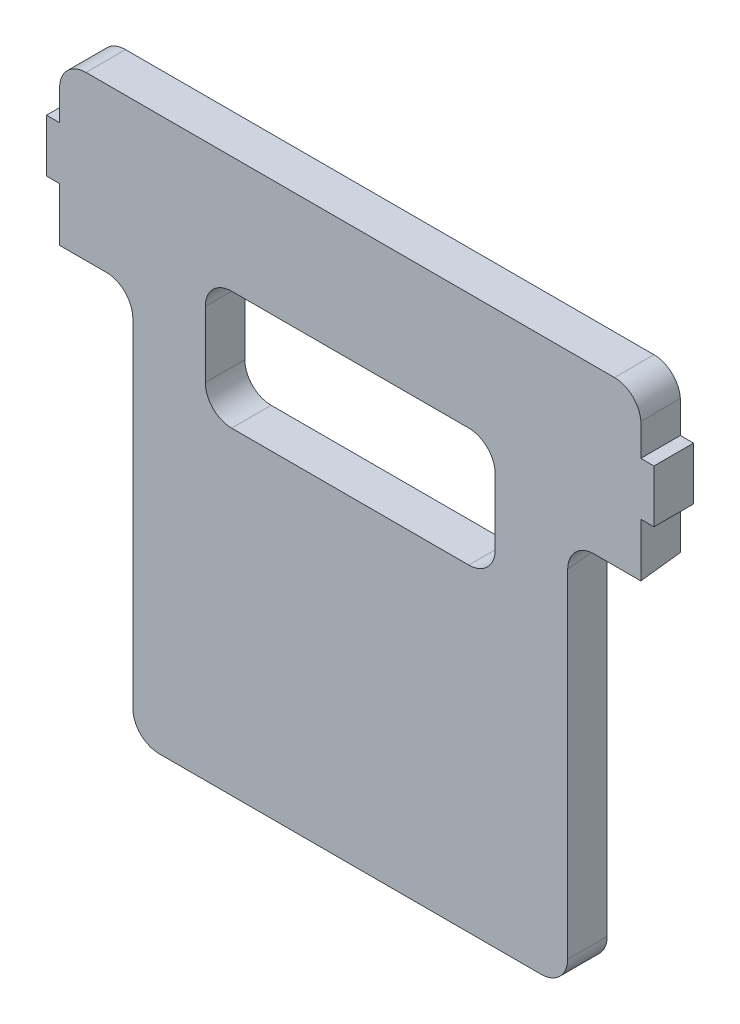
ISO-10303-21;
HEADER;
FILE_DESCRIPTION(('STEP AP214'),'2;1');
FILE_NAME('part.step','',(''),(''),'','','');
FILE_SCHEMA(('AUTOMOTIVE_DESIGN { 1 0 10303 214 1 1 1 1 }'));
ENDSEC;
DATA;
#1=APPLICATION_CONTEXT('core data for automotive mechanical design processes');
#2=APPLICATION_PROTOCOL_DEFINITION('international standard','automotive_design',2000,#1);
#3=PRODUCT_CONTEXT('',#1,'mechanical');
#4=PRODUCT('Part','Part','',(#3));
#5=PRODUCT_RELATED_PRODUCT_CATEGORY('part','',(#4));
#6=PRODUCT_DEFINITION_FORMATION('','',#4);
#7=PRODUCT_DEFINITION_CONTEXT('part definition',#1,'design');
#8=PRODUCT_DEFINITION('design','',#6,#7);
#9=PRODUCT_DEFINITION_SHAPE('','',#8);
#10=(LENGTH_UNIT() NAMED_UNIT(*) SI_UNIT(.MILLI.,.METRE.));
#11=(NAMED_UNIT(*) PLANE_ANGLE_UNIT() SI_UNIT($,.RADIAN.));
#12=(NAMED_UNIT(*) SI_UNIT($,.STERADIAN.) SOLID_ANGLE_UNIT());
#13=UNCERTAINTY_MEASURE_WITH_UNIT(LENGTH_MEASURE(1.E-05),#10,'distance_accuracy_value','');
#14=(GEOMETRIC_REPRESENTATION_CONTEXT(3) GLOBAL_UNCERTAINTY_ASSIGNED_CONTEXT((#13)) GLOBAL_UNIT_ASSIGNED_CONTEXT((#10,
#11,#12)) REPRESENTATION_CONTEXT('',''));
#15=CARTESIAN_POINT('',(0.,0.,0.));
#16=DIRECTION('',(0.,0.,1.));
#17=DIRECTION('',(1.,0.,0.));
#18=AXIS2_PLACEMENT_3D('',#15,#16,#17);
#19=CARTESIAN_POINT('',(-2.255,2.669025604004,-0.55));
#20=DIRECTION('',(0.,0.,-1.));
#21=DIRECTION('',(0.,1.,0.));
#22=AXIS2_PLACEMENT_3D('',#19,#20,#21);
#23=PLANE('',#22);
#24=CARTESIAN_POINT('',(-0.9,1.714936983007,-0.55));
#25=DIRECTION('',(0.,0.,-1.));
#26=DIRECTION('',(-1.,0.,0.));
#27=AXIS2_PLACEMENT_3D('',#24,#25,#26);
#28=CIRCLE('',#27,0.2);
#29=CARTESIAN_POINT('',(-1.1,1.714936983007,-0.55));
#30=VERTEX_POINT('',#29);
#31=CARTESIAN_POINT('',(-0.9,1.514936983007,-0.55));
#32=VERTEX_POINT('',#31);
#33=EDGE_CURVE('E178',#30,#32,#28,.F.);
#34=ORIENTED_EDGE('',*,*,#33,.T.);
#35=DIRECTION('',(1.,0.,0.));
#36=VECTOR('',#35,1.);
#37=CARTESIAN_POINT('',(0.,1.514936983007,-0.55));
#38=LINE('',#37,#36);
#39=CARTESIAN_POINT('',(0.9,1.514936983007,-0.55));
#40=VERTEX_POINT('',#39);
#41=EDGE_CURVE('E175',#32,#40,#38,.T.);
#42=ORIENTED_EDGE('',*,*,#41,.T.);
#43=CARTESIAN_POINT('',(0.9,1.714936983007,-0.55));
#44=DIRECTION('',(0.,0.,-1.));
#45=DIRECTION('',(-1.,0.,0.));
#46=AXIS2_PLACEMENT_3D('',#43,#44,#45);
#47=CIRCLE('',#46,0.2);
#48=CARTESIAN_POINT('',(1.1,1.714936983007,-0.55));
#49=VERTEX_POINT('',#48);
#50=EDGE_CURVE('E20',#40,#49,#47,.F.);
#51=ORIENTED_EDGE('',*,*,#50,.T.);
#52=DIRECTION('',(0.,1.,0.));
#53=VECTOR('',#52,1.);
#54=CARTESIAN_POINT('',(1.1,2.669025604004,-0.55));
#55=LINE('',#54,#53);
#56=CARTESIAN_POINT('',(1.1,2.214936983007,-0.55));
#57=VERTEX_POINT('',#56);
#58=EDGE_CURVE('E173',#49,#57,#55,.T.);
#59=ORIENTED_EDGE('',*,*,#58,.T.);
#60=CARTESIAN_POINT('',(0.9,2.214936983007,-0.55));
#61=DIRECTION('',(0.,0.,-1.));
#62=DIRECTION('',(-1.,0.,0.));
#63=AXIS2_PLACEMENT_3D('',#60,#61,#62);
#64=CIRCLE('',#63,0.2);
#65=CARTESIAN_POINT('',(0.9,2.414936983007,-0.55));
#66=VERTEX_POINT('',#65);
#67=EDGE_CURVE('E350',#57,#66,#64,.F.);
#68=ORIENTED_EDGE('',*,*,#67,.T.);
#69=DIRECTION('',(-1.,0.,0.));
#70=VECTOR('',#69,1.);
#71=CARTESIAN_POINT('',(0.,2.414936983007,-0.55));
#72=LINE('',#71,#70);
#73=CARTESIAN_POINT('',(-0.9,2.414936983007,-0.55));
#74=VERTEX_POINT('',#73);
#75=EDGE_CURVE('E203',#66,#74,#72,.T.);
#76=ORIENTED_EDGE('',*,*,#75,.T.);
#77=CARTESIAN_POINT('',(-0.9,2.214936983007,-0.55));
#78=DIRECTION('',(0.,0.,-1.));
#79=DIRECTION('',(-1.,0.,0.));
#80=AXIS2_PLACEMENT_3D('',#77,#78,#79);
#81=CIRCLE('',#80,0.2);
#82=CARTESIAN_POINT('',(-1.1,2.214936983007,-0.55));
#83=VERTEX_POINT('',#82);
#84=EDGE_CURVE('E199',#74,#83,#81,.F.);
#85=ORIENTED_EDGE('',*,*,#84,.T.);
#86=DIRECTION('',(0.,-1.,0.));
#87=VECTOR('',#86,1.);
#88=CARTESIAN_POINT('',(-1.1,1.964936983007,-0.55));
#89=LINE('',#88,#87);
#90=EDGE_CURVE('E195',#83,#30,#89,.T.);
#91=ORIENTED_EDGE('',*,*,#90,.T.);
#92=EDGE_LOOP('',(#34,#42,#51,#59,#68,#76,#85,#91));
#93=FACE_BOUND('',#92,.T.);
#94=DIRECTION('',(1.,0.,0.));
#95=VECTOR('',#94,1.);
#96=CARTESIAN_POINT('',(2.5,2.10000000000026,-0.549999999999968));
#97=LINE('',#96,#95);
#98=CARTESIAN_POINT('',(-1.85,2.10000000000024,-0.549999999999984));
#99=VERTEX_POINT('',#98);
#100=CARTESIAN_POINT('',(-2.205,2.10000000000009,-0.549999999999989));
#101=VERTEX_POINT('',#100);
#102=EDGE_CURVE('E207',#99,#101,#97,.F.);
#103=ORIENTED_EDGE('',*,*,#102,.T.);
#104=DIRECTION('',(0.,-1.,0.));
#105=VECTOR('',#104,1.);
#106=CARTESIAN_POINT('',(-2.205,0.721081883711,-0.55));
#107=LINE('',#106,#105);
#108=CARTESIAN_POINT('',(-2.205,2.469025604004,-0.55));
#109=VERTEX_POINT('',#108);
#110=EDGE_CURVE('E345',#109,#101,#107,.T.);
#111=ORIENTED_EDGE('',*,*,#110,.F.);
#112=DIRECTION('',(1.,0.,0.));
#113=VECTOR('',#112,1.);
#114=CARTESIAN_POINT('',(-2.255,2.469025604004,-0.55));
#115=LINE('',#114,#113);
#116=CARTESIAN_POINT('',(-2.305,2.469025604004,-0.55));
#117=VERTEX_POINT('',#116);
#118=EDGE_CURVE('E352',#117,#109,#115,.T.);
#119=ORIENTED_EDGE('',*,*,#118,.F.);
#120=DIRECTION('',(0.,-1.,0.));
#121=VECTOR('',#120,1.);
#122=CARTESIAN_POINT('',(-2.305,2.669025604004,-0.55));
#123=LINE('',#122,#121);
#124=CARTESIAN_POINT('',(-2.305,2.869025604004,-0.55));
#125=VERTEX_POINT('',#124);
#126=EDGE_CURVE('E335',#125,#117,#123,.T.);
#127=ORIENTED_EDGE('',*,*,#126,.F.);
#128=DIRECTION('',(1.,0.,0.));
#129=VECTOR('',#128,1.);
#130=CARTESIAN_POINT('',(-2.255,2.869025604004,-0.55));
#131=LINE('',#130,#129);
#132=CARTESIAN_POINT('',(-2.205,2.869025604004,-0.55));
#133=VERTEX_POINT('',#132);
#134=EDGE_CURVE('E324',#133,#125,#131,.F.);
#135=ORIENTED_EDGE('',*,*,#134,.F.);
#136=DIRECTION('',(0.,-1.,0.));
#137=VECTOR('',#136,1.);
#138=CARTESIAN_POINT('',(-2.205,0.721081883711,-0.55));
#139=LINE('',#138,#137);
#140=CARTESIAN_POINT('',(-2.20500000000021,3.11244231881834,-0.55));
#141=VERTEX_POINT('',#140);
#142=EDGE_CURVE('E311',#141,#133,#139,.T.);
#143=ORIENTED_EDGE('',*,*,#142,.F.);
#144=CARTESIAN_POINT('',(-2.005,3.099587296834,-0.55));
#145=DIRECTION('',(0.,0.,-1.));
#146=DIRECTION('',(-1.,0.,0.));
#147=AXIS2_PLACEMENT_3D('',#144,#145,#146);
#148=CIRCLE('',#147,0.200412703166);
#149=CARTESIAN_POINT('',(-2.005,3.3,-0.55));
#150=VERTEX_POINT('',#149);
#151=EDGE_CURVE('E307',#150,#141,#148,.F.);
#152=ORIENTED_EDGE('',*,*,#151,.F.);
#153=DIRECTION('',(-1.,0.,0.));
#154=VECTOR('',#153,1.);
#155=CARTESIAN_POINT('',(0.,3.3,-0.55));
#156=LINE('',#155,#154);
#157=CARTESIAN_POINT('',(2.005,3.3,-0.55));
#158=VERTEX_POINT('',#157);
#159=EDGE_CURVE('E304',#158,#150,#156,.T.);
#160=ORIENTED_EDGE('',*,*,#159,.F.);
#161=CARTESIAN_POINT('',(2.005,3.099587296834,-0.55));
#162=DIRECTION('',(0.,0.,-1.));
#163=DIRECTION('',(-1.,0.,0.));
#164=AXIS2_PLACEMENT_3D('',#161,#162,#163);
#165=CIRCLE('',#164,0.200412703166);
#166=CARTESIAN_POINT('',(2.205,3.11244231881833,-0.55));
#167=VERTEX_POINT('',#166);
#168=EDGE_CURVE('E301',#167,#158,#165,.F.);
#169=ORIENTED_EDGE('',*,*,#168,.F.);
#170=DIRECTION('',(0.,1.,0.));
#171=VECTOR('',#170,1.);
#172=CARTESIAN_POINT('',(2.205,0.721081883711,-0.55));
#173=LINE('',#172,#171);
#174=CARTESIAN_POINT('',(2.205,2.869025604004,-0.55));
#175=VERTEX_POINT('',#174);
#176=EDGE_CURVE('E298',#175,#167,#173,.T.);
#177=ORIENTED_EDGE('',*,*,#176,.F.);
#178=DIRECTION('',(-1.,0.,0.));
#179=VECTOR('',#178,1.);
#180=CARTESIAN_POINT('',(2.255,2.869025604004,-0.55));
#181=LINE('',#180,#179);
#182=CARTESIAN_POINT('',(2.305,2.869025604004,-0.55));
#183=VERTEX_POINT('',#182);
#184=EDGE_CURVE('E293',#183,#175,#181,.T.);
#185=ORIENTED_EDGE('',*,*,#184,.F.);
#186=DIRECTION('',(0.,1.,0.));
#187=VECTOR('',#186,1.);
#188=CARTESIAN_POINT('',(2.305,2.669025604004,-0.55));
#189=LINE('',#188,#187);
#190=CARTESIAN_POINT('',(2.305,2.469025604004,-0.55));
#191=VERTEX_POINT('',#190);
#192=EDGE_CURVE('E282',#191,#183,#189,.T.);
#193=ORIENTED_EDGE('',*,*,#192,.F.);
#194=DIRECTION('',(1.,0.,0.));
#195=VECTOR('',#194,1.);
#196=CARTESIAN_POINT('',(2.255,2.469025604004,-0.55));
#197=LINE('',#196,#195);
#198=CARTESIAN_POINT('',(2.205,2.469025604004,-0.55));
#199=VERTEX_POINT('',#198);
#200=EDGE_CURVE('E271',#199,#191,#197,.T.);
#201=ORIENTED_EDGE('',*,*,#200,.F.);
#202=DIRECTION('',(0.,1.,0.));
#203=VECTOR('',#202,1.);
#204=CARTESIAN_POINT('',(2.205,0.721081883711,-0.55));
#205=LINE('',#204,#203);
#206=CARTESIAN_POINT('',(2.205,2.10000000000018,-0.549999999999978));
#207=VERTEX_POINT('',#206);
#208=EDGE_CURVE('E260',#207,#199,#205,.T.);
#209=ORIENTED_EDGE('',*,*,#208,.F.);
#210=DIRECTION('',(1.,0.,0.));
#211=VECTOR('',#210,1.);
#212=CARTESIAN_POINT('',(2.5,2.10000000000026,-0.549999999999968));
#213=LINE('',#212,#211);
#214=CARTESIAN_POINT('',(1.85,2.10000000000022,-0.549999999999986));
#215=VERTEX_POINT('',#214);
#216=EDGE_CURVE('E244',#207,#215,#213,.F.);
#217=ORIENTED_EDGE('',*,*,#216,.T.);
#218=CARTESIAN_POINT('',(1.85,1.89849803490844,-0.55));
#219=DIRECTION('',(0.,0.,-1.));
#220=DIRECTION('',(0.,1.,0.));
#221=AXIS2_PLACEMENT_3D('',#218,#219,#220);
#222=ELLIPSE('',#221,0.201501965091767,0.2);
#223=CARTESIAN_POINT('',(1.65,1.89849803490822,-0.55));
#224=VERTEX_POINT('',#223);
#225=EDGE_CURVE('E243',#215,#224,#222,.F.);
#226=ORIENTED_EDGE('',*,*,#225,.T.);
#227=DIRECTION('',(0.,1.,0.));
#228=VECTOR('',#227,1.);
#229=CARTESIAN_POINT('',(1.65,1.3,-0.55));
#230=LINE('',#229,#228);
#231=CARTESIAN_POINT('',(1.65,-0.7,-0.55));
#232=VERTEX_POINT('',#231);
#233=EDGE_CURVE('E239',#232,#224,#230,.T.);
#234=ORIENTED_EDGE('',*,*,#233,.F.);
#235=CARTESIAN_POINT('',(1.45,-0.7,-0.55));
#236=DIRECTION('',(0.,0.,-1.));
#237=DIRECTION('',(-1.,0.,0.));
#238=AXIS2_PLACEMENT_3D('',#235,#236,#237);
#239=CIRCLE('',#238,0.2);
#240=CARTESIAN_POINT('',(1.45,-0.9,-0.55));
#241=VERTEX_POINT('',#240);
#242=EDGE_CURVE('E236',#241,#232,#239,.F.);
#243=ORIENTED_EDGE('',*,*,#242,.F.);
#244=DIRECTION('',(1.,0.,0.));
#245=VECTOR('',#244,1.);
#246=CARTESIAN_POINT('',(0.,-0.9,-0.55));
#247=LINE('',#246,#245);
#248=CARTESIAN_POINT('',(-1.45,-0.9,-0.55));
#249=VERTEX_POINT('',#248);
#250=EDGE_CURVE('E233',#249,#241,#247,.T.);
#251=ORIENTED_EDGE('',*,*,#250,.F.);
#252=CARTESIAN_POINT('',(-1.45,-0.7,-0.55));
#253=DIRECTION('',(0.,0.,-1.));
#254=DIRECTION('',(-1.,0.,0.));
#255=AXIS2_PLACEMENT_3D('',#252,#253,#254);
#256=CIRCLE('',#255,0.2);
#257=CARTESIAN_POINT('',(-1.65,-0.7,-0.55));
#258=VERTEX_POINT('',#257);
#259=EDGE_CURVE('E230',#258,#249,#256,.F.);
#260=ORIENTED_EDGE('',*,*,#259,.F.);
#261=DIRECTION('',(0.,-1.,0.));
#262=VECTOR('',#261,1.);
#263=CARTESIAN_POINT('',(-1.65,1.3,-0.55));
#264=LINE('',#263,#262);
#265=CARTESIAN_POINT('',(-1.65,1.89849803490814,-0.55));
#266=VERTEX_POINT('',#265);
#267=EDGE_CURVE('E225',#266,#258,#264,.T.);
#268=ORIENTED_EDGE('',*,*,#267,.F.);
#269=CARTESIAN_POINT('',(-1.85,1.89849803490844,-0.55));
#270=DIRECTION('',(0.,0.,-1.));
#271=DIRECTION('',(0.,-1.,0.));
#272=AXIS2_PLACEMENT_3D('',#269,#270,#271);
#273=ELLIPSE('',#272,0.201501965091767,0.2);
#274=EDGE_CURVE('E208',#266,#99,#273,.F.);
#275=ORIENTED_EDGE('',*,*,#274,.T.);
#276=EDGE_LOOP('',(#103,#111,#119,#127,#135,#143,#152,#160,#169,#177,#185,#193,#201,#209,#217,
#226,#234,#243,#251,#260,#268,#275));
#277=FACE_BOUND('',#276,.T.);
#278=ADVANCED_FACE('F17',(#93,#277),#23,.T.);
#279=CARTESIAN_POINT('',(-2.255,2.469025604004,-0.55));
#280=DIRECTION('',(0.,-1.,0.));
#281=DIRECTION('',(0.,0.,-1.));
#282=AXIS2_PLACEMENT_3D('',#279,#280,#281);
#283=PLANE('',#282);
#284=DIRECTION('',(1.,0.,0.));
#285=VECTOR('',#284,1.);
#286=CARTESIAN_POINT('',(-2.205,2.469025604004,-0.25));
#287=LINE('',#286,#285);
#288=CARTESIAN_POINT('',(-2.205,2.469025604004,-0.25));
#289=VERTEX_POINT('',#288);
#290=CARTESIAN_POINT('',(-2.305,2.469025604004,-0.25));
#291=VERTEX_POINT('',#290);
#292=EDGE_CURVE('E329',#289,#291,#287,.F.);
#293=ORIENTED_EDGE('',*,*,#292,.T.);
#294=DIRECTION('',(0.,0.,1.));
#295=VECTOR('',#294,1.);
#296=CARTESIAN_POINT('',(-2.305,2.469025604004,-0.55));
#297=LINE('',#296,#295);
#298=EDGE_CURVE('E332',#117,#291,#297,.T.);
#299=ORIENTED_EDGE('',*,*,#298,.F.);
#300=ORIENTED_EDGE('',*,*,#118,.T.);
#301=DIRECTION('',(0.,0.,1.));
#302=VECTOR('',#301,1.);
#303=CARTESIAN_POINT('',(-2.205,2.469025604004,-0.55));
#304=LINE('',#303,#302);
#305=EDGE_CURVE('E219',#289,#109,#304,.F.);
#306=ORIENTED_EDGE('',*,*,#305,.F.);
#307=EDGE_LOOP('',(#293,#299,#300,#306));
#308=FACE_BOUND('',#307,.T.);
#309=ADVANCED_FACE('F798',(#308),#283,.T.);
#310=CARTESIAN_POINT('',(-2.305,2.669025604004,-0.55));
#311=DIRECTION('',(-1.,0.,0.));
#312=DIRECTION('',(0.,-1.,0.));
#313=AXIS2_PLACEMENT_3D('',#310,#311,#312);
#314=PLANE('',#313);
#315=DIRECTION('',(0.,1.,0.));
#316=VECTOR('',#315,1.);
#317=CARTESIAN_POINT('',(-2.305,2.869025604004,-0.25));
#318=LINE('',#317,#316);
#319=CARTESIAN_POINT('',(-2.305,2.869025604004,-0.25));
#320=VERTEX_POINT('',#319);
#321=EDGE_CURVE('E318',#291,#320,#318,.T.);
#322=ORIENTED_EDGE('',*,*,#321,.T.);
#323=DIRECTION('',(0.,0.,1.));
#324=VECTOR('',#323,1.);
#325=CARTESIAN_POINT('',(-2.305,2.869025604004,-0.55));
#326=LINE('',#325,#324);
#327=EDGE_CURVE('E321',#125,#320,#326,.T.);
#328=ORIENTED_EDGE('',*,*,#327,.F.);
#329=ORIENTED_EDGE('',*,*,#126,.T.);
#330=ORIENTED_EDGE('',*,*,#298,.T.);
#331=EDGE_LOOP('',(#322,#328,#329,#330));
#332=FACE_BOUND('',#331,.T.);
#333=ADVANCED_FACE('F788',(#332),#314,.T.);
#334=CARTESIAN_POINT('',(-2.255,2.869025604004,-0.55));
#335=DIRECTION('',(0.,1.,0.));
#336=DIRECTION('',(0.,0.,1.));
#337=AXIS2_PLACEMENT_3D('',#334,#335,#336);
#338=PLANE('',#337);
#339=DIRECTION('',(1.,0.,0.));
#340=VECTOR('',#339,1.);
#341=CARTESIAN_POINT('',(-2.205,2.869025604004,-0.25));
#342=LINE('',#341,#340);
#343=CARTESIAN_POINT('',(-2.205,2.869025604004,-0.25));
#344=VERTEX_POINT('',#343);
#345=EDGE_CURVE('E314',#320,#344,#342,.T.);
#346=ORIENTED_EDGE('',*,*,#345,.T.);
#347=DIRECTION('',(0.,0.,1.));
#348=VECTOR('',#347,1.);
#349=CARTESIAN_POINT('',(-2.205,2.869025604004,-0.55));
#350=LINE('',#349,#348);
#351=EDGE_CURVE('E308',#133,#344,#350,.T.);
#352=ORIENTED_EDGE('',*,*,#351,.F.);
#353=ORIENTED_EDGE('',*,*,#134,.T.);
#354=ORIENTED_EDGE('',*,*,#327,.T.);
#355=EDGE_LOOP('',(#346,#352,#353,#354));
#356=FACE_BOUND('',#355,.T.);
#357=ADVANCED_FACE('F778',(#356),#338,.T.);
#358=CARTESIAN_POINT('',(-2.205,0.721081883711,-0.55));
#359=DIRECTION('',(-1.,0.,0.));
#360=DIRECTION('',(0.,-1.,0.));
#361=AXIS2_PLACEMENT_3D('',#358,#359,#360);
#362=PLANE('',#361);
#363=ORIENTED_EDGE('',*,*,#351,.T.);
#364=DIRECTION('',(0.,1.,0.));
#365=VECTOR('',#364,1.);
#366=CARTESIAN_POINT('',(-2.205,2.869025604004,-0.25));
#367=LINE('',#366,#365);
#368=CARTESIAN_POINT('',(-2.20500000000021,3.11244231881834,-0.25));
#369=VERTEX_POINT('',#368);
#370=EDGE_CURVE('E317',#344,#369,#367,.T.);
#371=ORIENTED_EDGE('',*,*,#370,.T.);
#372=DIRECTION('',(0.,0.,-1.));
#373=VECTOR('',#372,1.);
#374=CARTESIAN_POINT('',(-2.20500000000043,3.11244231881503,-0.55));
#375=LINE('',#374,#373);
#376=EDGE_CURVE('E305',#141,#369,#375,.F.);
#377=ORIENTED_EDGE('',*,*,#376,.F.);
#378=ORIENTED_EDGE('',*,*,#142,.T.);
#379=EDGE_LOOP('',(#363,#371,#377,#378));
#380=FACE_BOUND('',#379,.T.);
#381=ADVANCED_FACE('F768',(#380),#362,.T.);
#382=CARTESIAN_POINT('',(-2.005,3.099587296834,-0.55));
#383=DIRECTION('',(0.,0.,-1.));
#384=DIRECTION('',(-1.,0.,0.));
#385=AXIS2_PLACEMENT_3D('',#382,#383,#384);
#386=CYLINDRICAL_SURFACE('',#385,0.200412703166);
#387=ORIENTED_EDGE('',*,*,#376,.T.);
#388=CARTESIAN_POINT('',(-2.005,3.099587296834,-0.25));
#389=DIRECTION('',(0.,0.,-1.));
#390=DIRECTION('',(-1.,0.,0.));
#391=AXIS2_PLACEMENT_3D('',#388,#389,#390);
#392=CIRCLE('',#391,0.200412703166);
#393=CARTESIAN_POINT('',(-2.005,3.3,-0.25));
#394=VERTEX_POINT('',#393);
#395=EDGE_CURVE('E433',#369,#394,#392,.T.);
#396=ORIENTED_EDGE('',*,*,#395,.T.);
#397=DIRECTION('',(0.,0.,1.));
#398=VECTOR('',#397,1.);
#399=CARTESIAN_POINT('',(-2.005,3.3,-0.55));
#400=LINE('',#399,#398);
#401=EDGE_CURVE('E302',#150,#394,#400,.T.);
#402=ORIENTED_EDGE('',*,*,#401,.F.);
#403=ORIENTED_EDGE('',*,*,#151,.T.);
#404=EDGE_LOOP('',(#387,#396,#402,#403));
#405=FACE_BOUND('',#404,.T.);
#406=ADVANCED_FACE('F758',(#405),#386,.T.);
#407=CARTESIAN_POINT('',(0.,3.3,-0.55));
#408=DIRECTION('',(0.,1.,0.));
#409=DIRECTION('',(-1.,0.,0.));
#410=AXIS2_PLACEMENT_3D('',#407,#408,#409);
#411=PLANE('',#410);
#412=DIRECTION('',(1.,0.,0.));
#413=VECTOR('',#412,1.);
#414=CARTESIAN_POINT('',(-2.205,3.3,-0.25));
#415=LINE('',#414,#413);
#416=CARTESIAN_POINT('',(2.005,3.3,-0.25));
#417=VERTEX_POINT('',#416);
#418=EDGE_CURVE('E432',#394,#417,#415,.T.);
#419=ORIENTED_EDGE('',*,*,#418,.T.);
#420=DIRECTION('',(0.,0.,-1.));
#421=VECTOR('',#420,1.);
#422=CARTESIAN_POINT('',(2.005,3.3,-0.55));
#423=LINE('',#422,#421);
#424=EDGE_CURVE('E299',#158,#417,#423,.F.);
#425=ORIENTED_EDGE('',*,*,#424,.F.);
#426=ORIENTED_EDGE('',*,*,#159,.T.);
#427=ORIENTED_EDGE('',*,*,#401,.T.);
#428=EDGE_LOOP('',(#419,#425,#426,#427));
#429=FACE_BOUND('',#428,.T.);
#430=ADVANCED_FACE('F748',(#429),#411,.T.);
#431=CARTESIAN_POINT('',(2.005,3.099587296834,-0.55));
#432=DIRECTION('',(0.,0.,-1.));
#433=DIRECTION('',(-1.,0.,0.));
#434=AXIS2_PLACEMENT_3D('',#431,#432,#433);
#435=CYLINDRICAL_SURFACE('',#434,0.200412703166);
#436=ORIENTED_EDGE('',*,*,#424,.T.);
#437=CARTESIAN_POINT('',(2.005,3.099587296834,-0.25));
#438=DIRECTION('',(0.,0.,-1.));
#439=DIRECTION('',(-1.,0.,0.));
#440=AXIS2_PLACEMENT_3D('',#437,#438,#439);
#441=CIRCLE('',#440,0.200412703166);
#442=CARTESIAN_POINT('',(2.205,3.11244231881833,-0.25));
#443=VERTEX_POINT('',#442);
#444=EDGE_CURVE('E429',#417,#443,#441,.T.);
#445=ORIENTED_EDGE('',*,*,#444,.T.);
#446=DIRECTION('',(0.,0.,1.));
#447=VECTOR('',#446,1.);
#448=CARTESIAN_POINT('',(2.205,3.112442318815,-0.55));
#449=LINE('',#448,#447);
#450=EDGE_CURVE('E296',#167,#443,#449,.T.);
#451=ORIENTED_EDGE('',*,*,#450,.F.);
#452=ORIENTED_EDGE('',*,*,#168,.T.);
#453=EDGE_LOOP('',(#436,#445,#451,#452));
#454=FACE_BOUND('',#453,.T.);
#455=ADVANCED_FACE('F738',(#454),#435,.T.);
#456=CARTESIAN_POINT('',(2.205,0.721081883711,-0.55));
#457=DIRECTION('',(1.,0.,0.));
#458=DIRECTION('',(0.,1.,0.));
#459=AXIS2_PLACEMENT_3D('',#456,#457,#458);
#460=PLANE('',#459);
#461=DIRECTION('',(0.,0.,1.));
#462=VECTOR('',#461,1.);
#463=CARTESIAN_POINT('',(2.205,2.869025604004,-0.55));
#464=LINE('',#463,#462);
#465=CARTESIAN_POINT('',(2.205,2.869025604004,-0.25));
#466=VERTEX_POINT('',#465);
#467=EDGE_CURVE('E290',#175,#466,#464,.T.);
#468=ORIENTED_EDGE('',*,*,#467,.F.);
#469=ORIENTED_EDGE('',*,*,#176,.T.);
#470=ORIENTED_EDGE('',*,*,#450,.T.);
#471=DIRECTION('',(0.,1.,0.));
#472=VECTOR('',#471,1.);
#473=CARTESIAN_POINT('',(2.205,2.869025604004,-0.25));
#474=LINE('',#473,#472);
#475=EDGE_CURVE('E287',#443,#466,#474,.F.);
#476=ORIENTED_EDGE('',*,*,#475,.T.);
#477=EDGE_LOOP('',(#468,#469,#470,#476));
#478=FACE_BOUND('',#477,.T.);
#479=ADVANCED_FACE('F728',(#478),#460,.T.);
#480=CARTESIAN_POINT('',(2.255,2.869025604004,-0.55));
#481=DIRECTION('',(0.,1.,0.));
#482=DIRECTION('',(-1.,0.,0.));
#483=AXIS2_PLACEMENT_3D('',#480,#481,#482);
#484=PLANE('',#483);
#485=DIRECTION('',(1.,0.,0.));
#486=VECTOR('',#485,1.);
#487=CARTESIAN_POINT('',(-2.205,2.869025604004,-0.25));
#488=LINE('',#487,#486);
#489=CARTESIAN_POINT('',(2.305,2.869025604004,-0.25));
#490=VERTEX_POINT('',#489);
#491=EDGE_CURVE('E276',#466,#490,#488,.T.);
#492=ORIENTED_EDGE('',*,*,#491,.T.);
#493=DIRECTION('',(0.,0.,1.));
#494=VECTOR('',#493,1.);
#495=CARTESIAN_POINT('',(2.305,2.869025604004,-0.55));
#496=LINE('',#495,#494);
#497=EDGE_CURVE('E279',#183,#490,#496,.T.);
#498=ORIENTED_EDGE('',*,*,#497,.F.);
#499=ORIENTED_EDGE('',*,*,#184,.T.);
#500=ORIENTED_EDGE('',*,*,#467,.T.);
#501=EDGE_LOOP('',(#492,#498,#499,#500));
#502=FACE_BOUND('',#501,.T.);
#503=ADVANCED_FACE('F718',(#502),#484,.T.);
#504=CARTESIAN_POINT('',(2.305,2.669025604004,-0.55));
#505=DIRECTION('',(1.,0.,0.));
#506=DIRECTION('',(0.,1.,0.));
#507=AXIS2_PLACEMENT_3D('',#504,#505,#506);
#508=PLANE('',#507);
#509=DIRECTION('',(0.,1.,0.));
#510=VECTOR('',#509,1.);
#511=CARTESIAN_POINT('',(2.305,2.869025604004,-0.25));
#512=LINE('',#511,#510);
#513=CARTESIAN_POINT('',(2.305,2.469025604004,-0.25));
#514=VERTEX_POINT('',#513);
#515=EDGE_CURVE('E265',#490,#514,#512,.F.);
#516=ORIENTED_EDGE('',*,*,#515,.T.);
#517=DIRECTION('',(0.,0.,1.));
#518=VECTOR('',#517,1.);
#519=CARTESIAN_POINT('',(2.305,2.469025604004,-0.55));
#520=LINE('',#519,#518);
#521=EDGE_CURVE('E268',#191,#514,#520,.T.);
#522=ORIENTED_EDGE('',*,*,#521,.F.);
#523=ORIENTED_EDGE('',*,*,#192,.T.);
#524=ORIENTED_EDGE('',*,*,#497,.T.);
#525=EDGE_LOOP('',(#516,#522,#523,#524));
#526=FACE_BOUND('',#525,.T.);
#527=ADVANCED_FACE('F708',(#526),#508,.T.);
#528=CARTESIAN_POINT('',(2.255,2.469025604004,-0.55));
#529=DIRECTION('',(0.,-1.,0.));
#530=DIRECTION('',(1.,0.,0.));
#531=AXIS2_PLACEMENT_3D('',#528,#529,#530);
#532=PLANE('',#531);
#533=DIRECTION('',(1.,0.,0.));
#534=VECTOR('',#533,1.);
#535=CARTESIAN_POINT('',(-2.205,2.469025604004,-0.25));
#536=LINE('',#535,#534);
#537=CARTESIAN_POINT('',(2.205,2.469025604004,-0.25));
#538=VERTEX_POINT('',#537);
#539=EDGE_CURVE('E255',#514,#538,#536,.F.);
#540=ORIENTED_EDGE('',*,*,#539,.T.);
#541=DIRECTION('',(0.,0.,1.));
#542=VECTOR('',#541,1.);
#543=CARTESIAN_POINT('',(2.205,2.469025604004,-0.55));
#544=LINE('',#543,#542);
#545=EDGE_CURVE('E248',#199,#538,#544,.T.);
#546=ORIENTED_EDGE('',*,*,#545,.F.);
#547=ORIENTED_EDGE('',*,*,#200,.T.);
#548=ORIENTED_EDGE('',*,*,#521,.T.);
#549=EDGE_LOOP('',(#540,#546,#547,#548));
#550=FACE_BOUND('',#549,.T.);
#551=ADVANCED_FACE('F698',(#550),#532,.T.);
#552=CARTESIAN_POINT('',(2.205,0.721081883711,-0.55));
#553=DIRECTION('',(1.,0.,0.));
#554=DIRECTION('',(0.,1.,0.));
#555=AXIS2_PLACEMENT_3D('',#552,#553,#554);
#556=PLANE('',#555);
#557=ORIENTED_EDGE('',*,*,#545,.T.);
#558=DIRECTION('',(0.,1.,0.));
#559=VECTOR('',#558,1.);
#560=CARTESIAN_POINT('',(2.205,2.869025604004,-0.25));
#561=LINE('',#560,#559);
#562=CARTESIAN_POINT('',(2.205,2.06316463172914,-0.249999999999983));
#563=VERTEX_POINT('',#562);
#564=EDGE_CURVE('E251',#538,#563,#561,.F.);
#565=ORIENTED_EDGE('',*,*,#564,.T.);
#566=DIRECTION('',(0.,-0.121869343405041,0.992546151641335));
#567=VECTOR('',#566,1.);
#568=CARTESIAN_POINT('',(2.205,2.066234245752,-0.275));
#569=LINE('',#568,#567);
#570=EDGE_CURVE('E245',#563,#207,#569,.F.);
#571=ORIENTED_EDGE('',*,*,#570,.T.);
#572=ORIENTED_EDGE('',*,*,#208,.T.);
#573=EDGE_LOOP('',(#557,#565,#571,#572));
#574=FACE_BOUND('',#573,.T.);
#575=ADVANCED_FACE('F688',(#574),#556,.T.);
#576=CARTESIAN_POINT('',(2.5,2.066234245752,-0.275));
#577=DIRECTION('',(0.,0.992546151641335,0.121869343405041));
#578=DIRECTION('',(0.,-0.121869343405041,0.992546151641335));
#579=AXIS2_PLACEMENT_3D('',#576,#577,#578);
#580=PLANE('',#579);
#581=ORIENTED_EDGE('',*,*,#570,.F.);
#582=DIRECTION('',(1.,0.,0.));
#583=VECTOR('',#582,1.);
#584=CARTESIAN_POINT('',(-2.205,2.063164631729,-0.25));
#585=LINE('',#584,#583);
#586=CARTESIAN_POINT('',(1.85,2.06316463172927,-0.249999999999989));
#587=VERTEX_POINT('',#586);
#588=EDGE_CURVE('E254',#563,#587,#585,.F.);
#589=ORIENTED_EDGE('',*,*,#588,.T.);
#590=DIRECTION('',(0.,0.121869343405041,-0.992546151641335));
#591=VECTOR('',#590,1.);
#592=CARTESIAN_POINT('',(1.85,2.07717626813127,-0.364115620879992));
#593=LINE('',#592,#591);
#594=EDGE_CURVE('E240',#587,#215,#593,.T.);
#595=ORIENTED_EDGE('',*,*,#594,.T.);
#596=ORIENTED_EDGE('',*,*,#216,.F.);
#597=EDGE_LOOP('',(#581,#589,#595,#596));
#598=FACE_BOUND('',#597,.T.);
#599=ADVANCED_FACE('F678',(#598),#580,.F.);
#600=CARTESIAN_POINT('',(1.85,1.878667037803,-0.388489489561));
#601=DIRECTION('',(0.,0.121869343405041,-0.992546151641335));
#602=DIRECTION('',(0.,0.992546151641335,0.121869343405041));
#603=AXIS2_PLACEMENT_3D('',#600,#601,#602);
#604=CYLINDRICAL_SURFACE('',#603,0.2);
#605=DIRECTION('',(0.,-0.121869343405567,0.99254615164127));
#606=VECTOR('',#605,1.);
#607=CARTESIAN_POINT('',(1.65,1.898498034908,-0.55));
#608=LINE('',#607,#606);
#609=CARTESIAN_POINT('',(1.65,1.8616626666373,-0.25));
#610=VERTEX_POINT('',#609);
#611=EDGE_CURVE('E237',#224,#610,#608,.T.);
#612=ORIENTED_EDGE('',*,*,#611,.F.);
#613=ORIENTED_EDGE('',*,*,#225,.F.);
#614=ORIENTED_EDGE('',*,*,#594,.F.);
#615=CARTESIAN_POINT('',(1.85,1.8616626666376,-0.25));
#616=DIRECTION('',(0.,0.,-1.));
#617=DIRECTION('',(0.,1.,0.));
#618=AXIS2_PLACEMENT_3D('',#615,#616,#617);
#619=ELLIPSE('',#618,0.201501965091767,0.2);
#620=EDGE_CURVE('E426',#587,#610,#619,.F.);
#621=ORIENTED_EDGE('',*,*,#620,.T.);
#622=EDGE_LOOP('',(#612,#613,#614,#621));
#623=FACE_BOUND('',#622,.T.);
#624=ADVANCED_FACE('F668',(#623),#604,.F.);
#625=CARTESIAN_POINT('',(1.65,1.3,-0.55));
#626=DIRECTION('',(1.,0.,0.));
#627=DIRECTION('',(0.,1.,0.));
#628=AXIS2_PLACEMENT_3D('',#625,#626,#627);
#629=PLANE('',#628);
#630=ORIENTED_EDGE('',*,*,#611,.T.);
#631=DIRECTION('',(0.,1.,0.));
#632=VECTOR('',#631,1.);
#633=CARTESIAN_POINT('',(1.65,2.869025604004,-0.25));
#634=LINE('',#633,#632);
#635=CARTESIAN_POINT('',(1.65,-0.7,-0.25));
#636=VERTEX_POINT('',#635);
#637=EDGE_CURVE('E425',#610,#636,#634,.F.);
#638=ORIENTED_EDGE('',*,*,#637,.T.);
#639=DIRECTION('',(0.,0.,-1.));
#640=VECTOR('',#639,1.);
#641=CARTESIAN_POINT('',(1.65,-0.7,-0.55));
#642=LINE('',#641,#640);
#643=EDGE_CURVE('E234',#232,#636,#642,.F.);
#644=ORIENTED_EDGE('',*,*,#643,.F.);
#645=ORIENTED_EDGE('',*,*,#233,.T.);
#646=EDGE_LOOP('',(#630,#638,#644,#645));
#647=FACE_BOUND('',#646,.T.);
#648=ADVANCED_FACE('F658',(#647),#629,.T.);
#649=CARTESIAN_POINT('',(1.45,-0.7,-0.55));
#650=DIRECTION('',(0.,0.,-1.));
#651=DIRECTION('',(-1.,0.,0.));
#652=AXIS2_PLACEMENT_3D('',#649,#650,#651);
#653=CYLINDRICAL_SURFACE('',#652,0.2);
#654=ORIENTED_EDGE('',*,*,#643,.T.);
#655=CARTESIAN_POINT('',(1.45,-0.7,-0.25));
#656=DIRECTION('',(0.,0.,-1.));
#657=DIRECTION('',(-1.,0.,0.));
#658=AXIS2_PLACEMENT_3D('',#655,#656,#657);
#659=CIRCLE('',#658,0.2);
#660=CARTESIAN_POINT('',(1.45,-0.9,-0.25));
#661=VERTEX_POINT('',#660);
#662=EDGE_CURVE('E422',#636,#661,#659,.T.);
#663=ORIENTED_EDGE('',*,*,#662,.T.);
#664=DIRECTION('',(0.,0.,1.));
#665=VECTOR('',#664,1.);
#666=CARTESIAN_POINT('',(1.45,-0.9,-0.55));
#667=LINE('',#666,#665);
#668=EDGE_CURVE('E231',#241,#661,#667,.T.);
#669=ORIENTED_EDGE('',*,*,#668,.F.);
#670=ORIENTED_EDGE('',*,*,#242,.T.);
#671=EDGE_LOOP('',(#654,#663,#669,#670));
#672=FACE_BOUND('',#671,.T.);
#673=ADVANCED_FACE('F648',(#672),#653,.T.);
#674=CARTESIAN_POINT('',(0.,-0.9,-0.55));
#675=DIRECTION('',(0.,-1.,0.));
#676=DIRECTION('',(1.,0.,0.));
#677=AXIS2_PLACEMENT_3D('',#674,#675,#676);
#678=PLANE('',#677);
#679=DIRECTION('',(1.,0.,0.));
#680=VECTOR('',#679,1.);
#681=CARTESIAN_POINT('',(-2.205,-0.9,-0.25));
#682=LINE('',#681,#680);
#683=CARTESIAN_POINT('',(-1.45,-0.9,-0.25));
#684=VERTEX_POINT('',#683);
#685=EDGE_CURVE('E421',#661,#684,#682,.F.);
#686=ORIENTED_EDGE('',*,*,#685,.T.);
#687=DIRECTION('',(0.,0.,-1.));
#688=VECTOR('',#687,1.);
#689=CARTESIAN_POINT('',(-1.45,-0.9,-0.55));
#690=LINE('',#689,#688);
#691=EDGE_CURVE('E228',#249,#684,#690,.F.);
#692=ORIENTED_EDGE('',*,*,#691,.F.);
#693=ORIENTED_EDGE('',*,*,#250,.T.);
#694=ORIENTED_EDGE('',*,*,#668,.T.);
#695=EDGE_LOOP('',(#686,#692,#693,#694));
#696=FACE_BOUND('',#695,.T.);
#697=ADVANCED_FACE('F638',(#696),#678,.T.);
#698=CARTESIAN_POINT('',(-1.45,-0.7,-0.55));
#699=DIRECTION('',(0.,0.,-1.));
#700=DIRECTION('',(-1.,0.,0.));
#701=AXIS2_PLACEMENT_3D('',#698,#699,#700);
#702=CYLINDRICAL_SURFACE('',#701,0.2);
#703=ORIENTED_EDGE('',*,*,#691,.T.);
#704=CARTESIAN_POINT('',(-1.45,-0.7,-0.25));
#705=DIRECTION('',(0.,0.,-1.));
#706=DIRECTION('',(-1.,0.,0.));
#707=AXIS2_PLACEMENT_3D('',#704,#705,#706);
#708=CIRCLE('',#707,0.2);
#709=CARTESIAN_POINT('',(-1.65,-0.7,-0.25));
#710=VERTEX_POINT('',#709);
#711=EDGE_CURVE('E418',#684,#710,#708,.T.);
#712=ORIENTED_EDGE('',*,*,#711,.T.);
#713=DIRECTION('',(0.,0.,1.));
#714=VECTOR('',#713,1.);
#715=CARTESIAN_POINT('',(-1.65,-0.7,-0.55));
#716=LINE('',#715,#714);
#717=EDGE_CURVE('E226',#258,#710,#716,.T.);
#718=ORIENTED_EDGE('',*,*,#717,.F.);
#719=ORIENTED_EDGE('',*,*,#259,.T.);
#720=EDGE_LOOP('',(#703,#712,#718,#719));
#721=FACE_BOUND('',#720,.T.);
#722=ADVANCED_FACE('F628',(#721),#702,.T.);
#723=CARTESIAN_POINT('',(-1.65,1.3,-0.55));
#724=DIRECTION('',(-1.,0.,0.));
#725=DIRECTION('',(0.,-1.,0.));
#726=AXIS2_PLACEMENT_3D('',#723,#724,#725);
#727=PLANE('',#726);
#728=DIRECTION('',(0.,-0.121869343405041,0.992546151641335));
#729=VECTOR('',#728,1.);
#730=CARTESIAN_POINT('',(-1.65,1.87866703780241,-0.388489489561073));
#731=LINE('',#730,#729);
#732=CARTESIAN_POINT('',(-1.65,1.8616626666373,-0.25));
#733=VERTEX_POINT('',#732);
#734=EDGE_CURVE('E222',#733,#266,#731,.F.);
#735=ORIENTED_EDGE('',*,*,#734,.T.);
#736=ORIENTED_EDGE('',*,*,#267,.T.);
#737=ORIENTED_EDGE('',*,*,#717,.T.);
#738=DIRECTION('',(0.,1.,0.));
#739=VECTOR('',#738,1.);
#740=CARTESIAN_POINT('',(-1.65,2.869025604004,-0.25));
#741=LINE('',#740,#739);
#742=EDGE_CURVE('E417',#710,#733,#741,.T.);
#743=ORIENTED_EDGE('',*,*,#742,.T.);
#744=EDGE_LOOP('',(#735,#736,#737,#743));
#745=FACE_BOUND('',#744,.T.);
#746=ADVANCED_FACE('F618',(#745),#727,.T.);
#747=CARTESIAN_POINT('',(-1.85,1.878667037803,-0.388489489561));
#748=DIRECTION('',(0.,-0.121869343405041,0.992546151641335));
#749=DIRECTION('',(0.,-0.992546151641335,-0.121869343405041));
#750=AXIS2_PLACEMENT_3D('',#747,#748,#749);
#751=CYLINDRICAL_SURFACE('',#750,0.2);
#752=DIRECTION('',(0.,-0.121869343405041,0.992546151641335));
#753=VECTOR('',#752,1.);
#754=CARTESIAN_POINT('',(-1.85,2.066234245752,-0.275));
#755=LINE('',#754,#753);
#756=CARTESIAN_POINT('',(-1.85,2.06316463172932,-0.249999999999987));
#757=VERTEX_POINT('',#756);
#758=EDGE_CURVE('E204',#757,#99,#755,.F.);
#759=ORIENTED_EDGE('',*,*,#758,.T.);
#760=ORIENTED_EDGE('',*,*,#274,.F.);
#761=ORIENTED_EDGE('',*,*,#734,.F.);
#762=CARTESIAN_POINT('',(-1.85,1.8616626666376,-0.25));
#763=DIRECTION('',(0.,0.,-1.));
#764=DIRECTION('',(0.,-1.,0.));
#765=AXIS2_PLACEMENT_3D('',#762,#763,#764);
#766=ELLIPSE('',#765,0.201501965091767,0.2);
#767=EDGE_CURVE('E414',#733,#757,#766,.F.);
#768=ORIENTED_EDGE('',*,*,#767,.T.);
#769=EDGE_LOOP('',(#759,#760,#761,#768));
#770=FACE_BOUND('',#769,.T.);
#771=ADVANCED_FACE('F608',(#770),#751,.F.);
#772=CARTESIAN_POINT('',(2.5,2.066234245752,-0.275));
#773=DIRECTION('',(0.,0.992546151641335,0.121869343405041));
#774=DIRECTION('',(0.,-0.121869343405041,0.992546151641335));
#775=AXIS2_PLACEMENT_3D('',#772,#773,#774);
#776=PLANE('',#775);
#777=DIRECTION('',(0.,-0.121869343405566,0.992546151641271));
#778=VECTOR('',#777,1.);
#779=CARTESIAN_POINT('',(-2.205,2.1,-0.55));
#780=LINE('',#779,#778);
#781=CARTESIAN_POINT('',(-2.205,2.063164631729,-0.25));
#782=VERTEX_POINT('',#781);
#783=EDGE_CURVE('E216',#101,#782,#780,.T.);
#784=ORIENTED_EDGE('',*,*,#783,.F.);
#785=ORIENTED_EDGE('',*,*,#102,.F.);
#786=ORIENTED_EDGE('',*,*,#758,.F.);
#787=DIRECTION('',(1.,0.,0.));
#788=VECTOR('',#787,1.);
#789=CARTESIAN_POINT('',(-2.205,2.063164631729,-0.25));
#790=LINE('',#789,#788);
#791=EDGE_CURVE('E213',#757,#782,#790,.F.);
#792=ORIENTED_EDGE('',*,*,#791,.T.);
#793=EDGE_LOOP('',(#784,#785,#786,#792));
#794=FACE_BOUND('',#793,.T.);
#795=ADVANCED_FACE('F598',(#794),#776,.F.);
#796=CARTESIAN_POINT('',(-2.205,0.721081883711,-0.55));
#797=DIRECTION('',(-1.,0.,0.));
#798=DIRECTION('',(0.,-1.,0.));
#799=AXIS2_PLACEMENT_3D('',#796,#797,#798);
#800=PLANE('',#799);
#801=ORIENTED_EDGE('',*,*,#305,.T.);
#802=ORIENTED_EDGE('',*,*,#110,.T.);
#803=ORIENTED_EDGE('',*,*,#783,.T.);
#804=DIRECTION('',(0.,1.,0.));
#805=VECTOR('',#804,1.);
#806=CARTESIAN_POINT('',(-2.205,2.869025604004,-0.25));
#807=LINE('',#806,#805);
#808=EDGE_CURVE('E209',#782,#289,#807,.T.);
#809=ORIENTED_EDGE('',*,*,#808,.T.);
#810=EDGE_LOOP('',(#801,#802,#803,#809));
#811=FACE_BOUND('',#810,.T.);
#812=ADVANCED_FACE('F589',(#811),#800,.T.);
#813=CARTESIAN_POINT('',(0.,2.414936983007,-0.55));
#814=DIRECTION('',(0.,1.,0.));
#815=DIRECTION('',(-1.,0.,0.));
#816=AXIS2_PLACEMENT_3D('',#813,#814,#815);
#817=PLANE('',#816);
#818=ORIENTED_EDGE('',*,*,#75,.F.);
#819=DIRECTION('',(0.,0.,-1.));
#820=VECTOR('',#819,1.);
#821=CARTESIAN_POINT('',(0.9,2.414936983007,-0.55));
#822=LINE('',#821,#820);
#823=CARTESIAN_POINT('',(0.9,2.414936983007,-0.25));
#824=VERTEX_POINT('',#823);
#825=EDGE_CURVE('E340',#66,#824,#822,.F.);
#826=ORIENTED_EDGE('',*,*,#825,.T.);
#827=DIRECTION('',(1.,0.,0.));
#828=VECTOR('',#827,1.);
#829=CARTESIAN_POINT('',(-2.205,2.414936983007,-0.25));
#830=LINE('',#829,#828);
#831=CARTESIAN_POINT('',(-0.9,2.414936983007,-0.25));
#832=VERTEX_POINT('',#831);
#833=EDGE_CURVE('E212',#824,#832,#830,.F.);
#834=ORIENTED_EDGE('',*,*,#833,.T.);
#835=DIRECTION('',(0.,0.,-1.));
#836=VECTOR('',#835,1.);
#837=CARTESIAN_POINT('',(-0.9,2.414936983007,-0.55));
#838=LINE('',#837,#836);
#839=EDGE_CURVE('E200',#832,#74,#838,.T.);
#840=ORIENTED_EDGE('',*,*,#839,.T.);
#841=EDGE_LOOP('',(#818,#826,#834,#840));
#842=FACE_BOUND('',#841,.T.);
#843=ADVANCED_FACE('F449',(#842),#817,.F.);
#844=CARTESIAN_POINT('',(-0.9,2.214936983007,-0.55));
#845=DIRECTION('',(0.,0.,-1.));
#846=DIRECTION('',(-1.,0.,0.));
#847=AXIS2_PLACEMENT_3D('',#844,#845,#846);
#848=CYLINDRICAL_SURFACE('',#847,0.2);
#849=DIRECTION('',(0.,0.,1.));
#850=VECTOR('',#849,1.);
#851=CARTESIAN_POINT('',(-1.1,2.214936983007,-0.55));
#852=LINE('',#851,#850);
#853=CARTESIAN_POINT('',(-1.1,2.214936983007,-0.25));
#854=VERTEX_POINT('',#853);
#855=EDGE_CURVE('E196',#854,#83,#852,.F.);
#856=ORIENTED_EDGE('',*,*,#855,.T.);
#857=ORIENTED_EDGE('',*,*,#84,.F.);
#858=ORIENTED_EDGE('',*,*,#839,.F.);
#859=CARTESIAN_POINT('',(-0.9,2.214936983007,-0.25));
#860=DIRECTION('',(0.,0.,-1.));
#861=DIRECTION('',(-1.,0.,0.));
#862=AXIS2_PLACEMENT_3D('',#859,#860,#861);
#863=CIRCLE('',#862,0.2);
#864=EDGE_CURVE('E411',#832,#854,#863,.F.);
#865=ORIENTED_EDGE('',*,*,#864,.T.);
#866=EDGE_LOOP('',(#856,#857,#858,#865));
#867=FACE_BOUND('',#866,.T.);
#868=ADVANCED_FACE('F493',(#867),#848,.F.);
#869=CARTESIAN_POINT('',(-1.1,1.964936983007,-0.55));
#870=DIRECTION('',(-1.,0.,0.));
#871=DIRECTION('',(0.,-1.,0.));
#872=AXIS2_PLACEMENT_3D('',#869,#870,#871);
#873=PLANE('',#872);
#874=ORIENTED_EDGE('',*,*,#90,.F.);
#875=ORIENTED_EDGE('',*,*,#855,.F.);
#876=DIRECTION('',(0.,1.,0.));
#877=VECTOR('',#876,1.);
#878=CARTESIAN_POINT('',(-1.1,2.869025604004,-0.25));
#879=LINE('',#878,#877);
#880=CARTESIAN_POINT('',(-1.1,1.714936983007,-0.25));
#881=VERTEX_POINT('',#880);
#882=EDGE_CURVE('E410',#854,#881,#879,.F.);
#883=ORIENTED_EDGE('',*,*,#882,.T.);
#884=DIRECTION('',(0.,0.,-1.));
#885=VECTOR('',#884,1.);
#886=CARTESIAN_POINT('',(-1.1,1.714936983007,-0.55));
#887=LINE('',#886,#885);
#888=EDGE_CURVE('E192',#881,#30,#887,.T.);
#889=ORIENTED_EDGE('',*,*,#888,.T.);
#890=EDGE_LOOP('',(#874,#875,#883,#889));
#891=FACE_BOUND('',#890,.T.);
#892=ADVANCED_FACE('F496',(#891),#873,.F.);
#893=CARTESIAN_POINT('',(-0.9,1.714936983007,-0.55));
#894=DIRECTION('',(0.,0.,-1.));
#895=DIRECTION('',(-1.,0.,0.));
#896=AXIS2_PLACEMENT_3D('',#893,#894,#895);
#897=CYLINDRICAL_SURFACE('',#896,0.2);
#898=DIRECTION('',(0.,0.,1.));
#899=VECTOR('',#898,1.);
#900=CARTESIAN_POINT('',(-0.9,1.514936983007,-0.55));
#901=LINE('',#900,#899);
#902=CARTESIAN_POINT('',(-0.9,1.514936983007,-0.25));
#903=VERTEX_POINT('',#902);
#904=EDGE_CURVE('E181',#903,#32,#901,.F.);
#905=ORIENTED_EDGE('',*,*,#904,.T.);
#906=ORIENTED_EDGE('',*,*,#33,.F.);
#907=ORIENTED_EDGE('',*,*,#888,.F.);
#908=CARTESIAN_POINT('',(-0.9,1.714936983007,-0.25));
#909=DIRECTION('',(0.,0.,-1.));
#910=DIRECTION('',(-1.,0.,0.));
#911=AXIS2_PLACEMENT_3D('',#908,#909,#910);
#912=CIRCLE('',#911,0.2);
#913=EDGE_CURVE('E407',#881,#903,#912,.F.);
#914=ORIENTED_EDGE('',*,*,#913,.T.);
#915=EDGE_LOOP('',(#905,#906,#907,#914));
#916=FACE_BOUND('',#915,.T.);
#917=ADVANCED_FACE('F498',(#916),#897,.F.);
#918=CARTESIAN_POINT('',(0.,1.514936983007,-0.55));
#919=DIRECTION('',(0.,-1.,0.));
#920=DIRECTION('',(1.,0.,0.));
#921=AXIS2_PLACEMENT_3D('',#918,#919,#920);
#922=PLANE('',#921);
#923=ORIENTED_EDGE('',*,*,#41,.F.);
#924=ORIENTED_EDGE('',*,*,#904,.F.);
#925=DIRECTION('',(1.,0.,0.));
#926=VECTOR('',#925,1.);
#927=CARTESIAN_POINT('',(-2.205,1.514936983007,-0.25));
#928=LINE('',#927,#926);
#929=CARTESIAN_POINT('',(0.9,1.514936983007,-0.25));
#930=VERTEX_POINT('',#929);
#931=EDGE_CURVE('E186',#903,#930,#928,.T.);
#932=ORIENTED_EDGE('',*,*,#931,.T.);
#933=DIRECTION('',(0.,0.,-1.));
#934=VECTOR('',#933,1.);
#935=CARTESIAN_POINT('',(0.9,1.514936983007,-0.55));
#936=LINE('',#935,#934);
#937=EDGE_CURVE('E168',#930,#40,#936,.T.);
#938=ORIENTED_EDGE('',*,*,#937,.T.);
#939=EDGE_LOOP('',(#923,#924,#932,#938));
#940=FACE_BOUND('',#939,.T.);
#941=ADVANCED_FACE('F184',(#940),#922,.F.);
#942=CARTESIAN_POINT('',(0.9,1.714936983007,-0.55));
#943=DIRECTION('',(0.,0.,-1.));
#944=DIRECTION('',(-1.,0.,0.));
#945=AXIS2_PLACEMENT_3D('',#942,#943,#944);
#946=CYLINDRICAL_SURFACE('',#945,0.2);
#947=DIRECTION('',(0.,0.,1.));
#948=VECTOR('',#947,1.);
#949=CARTESIAN_POINT('',(1.1,1.714936983007,-0.55));
#950=LINE('',#949,#948);
#951=CARTESIAN_POINT('',(1.1,1.714936983007,-0.25));
#952=VERTEX_POINT('',#951);
#953=EDGE_CURVE('E170',#952,#49,#950,.F.);
#954=ORIENTED_EDGE('',*,*,#953,.T.);
#955=ORIENTED_EDGE('',*,*,#50,.F.);
#956=ORIENTED_EDGE('',*,*,#937,.F.);
#957=CARTESIAN_POINT('',(0.9,1.714936983007,-0.25));
#958=DIRECTION('',(0.,0.,-1.));
#959=DIRECTION('',(-1.,0.,0.));
#960=AXIS2_PLACEMENT_3D('',#957,#958,#959);
#961=CIRCLE('',#960,0.2);
#962=EDGE_CURVE('E405',#930,#952,#961,.F.);
#963=ORIENTED_EDGE('',*,*,#962,.T.);
#964=EDGE_LOOP('',(#954,#955,#956,#963));
#965=FACE_BOUND('',#964,.T.);
#966=ADVANCED_FACE('F165',(#965),#946,.F.);
#967=CARTESIAN_POINT('',(1.1,1.964936983007,-0.55));
#968=DIRECTION('',(1.,0.,0.));
#969=DIRECTION('',(0.,1.,0.));
#970=AXIS2_PLACEMENT_3D('',#967,#968,#969);
#971=PLANE('',#970);
#972=ORIENTED_EDGE('',*,*,#58,.F.);
#973=ORIENTED_EDGE('',*,*,#953,.F.);
#974=DIRECTION('',(0.,1.,0.));
#975=VECTOR('',#974,1.);
#976=CARTESIAN_POINT('',(1.1,2.869025604004,-0.25));
#977=LINE('',#976,#975);
#978=CARTESIAN_POINT('',(1.1,2.214936983007,-0.25));
#979=VERTEX_POINT('',#978);
#980=EDGE_CURVE('E26',#952,#979,#977,.T.);
#981=ORIENTED_EDGE('',*,*,#980,.T.);
#982=DIRECTION('',(0.,0.,-1.));
#983=VECTOR('',#982,1.);
#984=CARTESIAN_POINT('',(1.1,2.214936983007,-0.55));
#985=LINE('',#984,#983);
#986=EDGE_CURVE('E34',#979,#57,#985,.T.);
#987=ORIENTED_EDGE('',*,*,#986,.T.);
#988=EDGE_LOOP('',(#972,#973,#981,#987));
#989=FACE_BOUND('',#988,.T.);
#990=ADVANCED_FACE('F485',(#989),#971,.F.);
#991=CARTESIAN_POINT('',(0.9,2.214936983007,-0.55));
#992=DIRECTION('',(0.,0.,-1.));
#993=DIRECTION('',(-1.,0.,0.));
#994=AXIS2_PLACEMENT_3D('',#991,#992,#993);
#995=CYLINDRICAL_SURFACE('',#994,0.2);
#996=ORIENTED_EDGE('',*,*,#825,.F.);
#997=ORIENTED_EDGE('',*,*,#67,.F.);
#998=ORIENTED_EDGE('',*,*,#986,.F.);
#999=CARTESIAN_POINT('',(0.9,2.214936983007,-0.25));
#1000=DIRECTION('',(0.,0.,-1.));
#1001=DIRECTION('',(-1.,0.,0.));
#1002=AXIS2_PLACEMENT_3D('',#999,#1000,#1001);
#1003=CIRCLE('',#1002,0.2);
#1004=EDGE_CURVE('E11',#979,#824,#1003,.F.);
#1005=ORIENTED_EDGE('',*,*,#1004,.T.);
#1006=EDGE_LOOP('',(#996,#997,#998,#1005));
#1007=FACE_BOUND('',#1006,.T.);
#1008=ADVANCED_FACE('F451',(#1007),#995,.F.);
#1009=CARTESIAN_POINT('',(-2.205,2.869025604004,-0.25));
#1010=DIRECTION('',(0.,0.,-1.));
#1011=DIRECTION('',(0.,1.,0.));
#1012=AXIS2_PLACEMENT_3D('',#1009,#1010,#1011);
#1013=PLANE('',#1012);
#1014=ORIENTED_EDGE('',*,*,#980,.F.);
#1015=ORIENTED_EDGE('',*,*,#962,.F.);
#1016=ORIENTED_EDGE('',*,*,#931,.F.);
#1017=ORIENTED_EDGE('',*,*,#913,.F.);
#1018=ORIENTED_EDGE('',*,*,#882,.F.);
#1019=ORIENTED_EDGE('',*,*,#864,.F.);
#1020=ORIENTED_EDGE('',*,*,#833,.F.);
#1021=ORIENTED_EDGE('',*,*,#1004,.F.);
#1022=EDGE_LOOP('',(#1014,#1015,#1016,#1017,#1018,#1019,#1020,#1021));
#1023=FACE_BOUND('',#1022,.T.);
#1024=ORIENTED_EDGE('',*,*,#791,.F.);
#1025=ORIENTED_EDGE('',*,*,#767,.F.);
#1026=ORIENTED_EDGE('',*,*,#742,.F.);
#1027=ORIENTED_EDGE('',*,*,#711,.F.);
#1028=ORIENTED_EDGE('',*,*,#685,.F.);
#1029=ORIENTED_EDGE('',*,*,#662,.F.);
#1030=ORIENTED_EDGE('',*,*,#637,.F.);
#1031=ORIENTED_EDGE('',*,*,#620,.F.);
#1032=ORIENTED_EDGE('',*,*,#588,.F.);
#1033=ORIENTED_EDGE('',*,*,#564,.F.);
#1034=ORIENTED_EDGE('',*,*,#539,.F.);
#1035=ORIENTED_EDGE('',*,*,#515,.F.);
#1036=ORIENTED_EDGE('',*,*,#491,.F.);
#1037=ORIENTED_EDGE('',*,*,#475,.F.);
#1038=ORIENTED_EDGE('',*,*,#444,.F.);
#1039=ORIENTED_EDGE('',*,*,#418,.F.);
#1040=ORIENTED_EDGE('',*,*,#395,.F.);
#1041=ORIENTED_EDGE('',*,*,#370,.F.);
#1042=ORIENTED_EDGE('',*,*,#345,.F.);
#1043=ORIENTED_EDGE('',*,*,#321,.F.);
#1044=ORIENTED_EDGE('',*,*,#292,.F.);
#1045=ORIENTED_EDGE('',*,*,#808,.F.);
#1046=EDGE_LOOP('',(#1024,#1025,#1026,#1027,#1028,#1029,#1030,#1031,#1032,#1033,#1034,#1035,
#1036,#1037,#1038,#1039,#1040,#1041,#1042,#1043,#1044,#1045));
#1047=FACE_BOUND('',#1046,.T.);
#1048=ADVANCED_FACE('F487',(#1023,#1047),#1013,.F.);
#1049=CLOSED_SHELL('',(#278,#309,#333,#357,#381,#406,#430,#455,#479,#503,#527,#551,#575,#599,
#624,#648,#673,#697,#722,#746,#771,#795,#812,#843,#868,#892,#917,#941,#966,#990,#1008,#1048));
#1050=MANIFOLD_SOLID_BREP('B1',#1049);
#1051=ADVANCED_BREP_SHAPE_REPRESENTATION('',(#18,#1050),#14);
#1052=SHAPE_DEFINITION_REPRESENTATION(#9,#1051);
ENDSEC;
END-ISO-10303-21;
